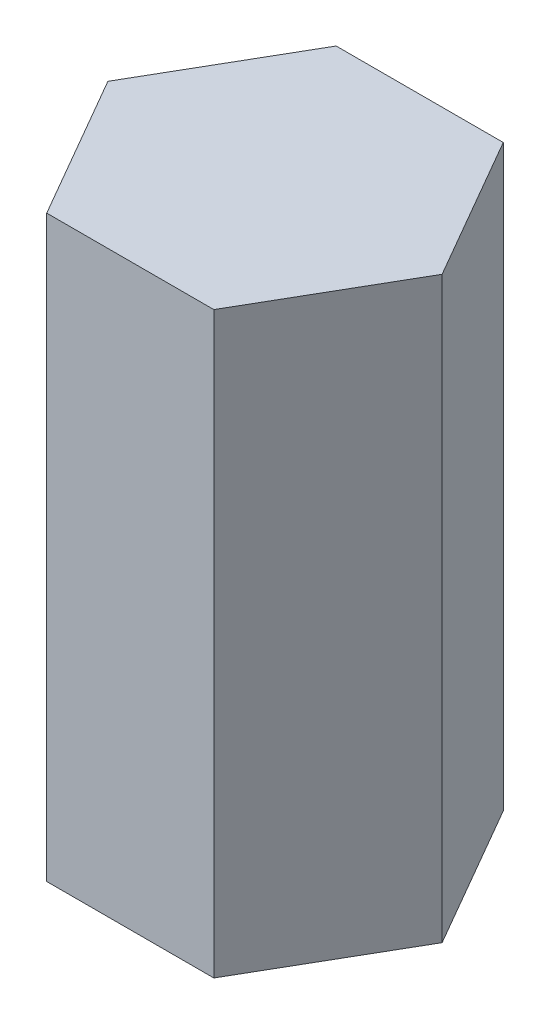
ISO-10303-21;
HEADER;
FILE_DESCRIPTION(('STEP AP214'),'2;1');
FILE_NAME('part.step','',(''),(''),'','','');
FILE_SCHEMA(('AUTOMOTIVE_DESIGN { 1 0 10303 214 1 1 1 1 }'));
ENDSEC;
DATA;
#1=APPLICATION_CONTEXT('core data for automotive mechanical design processes');
#2=APPLICATION_PROTOCOL_DEFINITION('international standard','automotive_design',2000,#1);
#3=PRODUCT_CONTEXT('',#1,'mechanical');
#4=PRODUCT('Part','Part','',(#3));
#5=PRODUCT_RELATED_PRODUCT_CATEGORY('part','',(#4));
#6=PRODUCT_DEFINITION_FORMATION('','',#4);
#7=PRODUCT_DEFINITION_CONTEXT('part definition',#1,'design');
#8=PRODUCT_DEFINITION('design','',#6,#7);
#9=PRODUCT_DEFINITION_SHAPE('','',#8);
#10=(LENGTH_UNIT() NAMED_UNIT(*) SI_UNIT(.MILLI.,.METRE.));
#11=(NAMED_UNIT(*) PLANE_ANGLE_UNIT() SI_UNIT($,.RADIAN.));
#12=(NAMED_UNIT(*) SI_UNIT($,.STERADIAN.) SOLID_ANGLE_UNIT());
#13=UNCERTAINTY_MEASURE_WITH_UNIT(LENGTH_MEASURE(1.E-05),#10,'distance_accuracy_value','');
#14=(GEOMETRIC_REPRESENTATION_CONTEXT(3) GLOBAL_UNCERTAINTY_ASSIGNED_CONTEXT((#13)) GLOBAL_UNIT_ASSIGNED_CONTEXT((#10,
#11,#12)) REPRESENTATION_CONTEXT('',''));
#15=CARTESIAN_POINT('',(0.,0.,0.));
#16=DIRECTION('',(0.,0.,1.));
#17=DIRECTION('',(1.,0.,0.));
#18=AXIS2_PLACEMENT_3D('',#15,#16,#17);
#19=CARTESIAN_POINT('',(4.33012701892219,30.,7.50000000000002));
#20=DIRECTION('',(-0.866025403784439,0.,-0.5));
#21=DIRECTION('',(-0.5,0.,0.866025403784439));
#22=AXIS2_PLACEMENT_3D('',#19,#20,#21);
#23=PLANE('',#22);
#24=DIRECTION('',(0.5,0.,-0.866025403784439));
#25=VECTOR('',#24,1.);
#26=CARTESIAN_POINT('',(4.33012701892219,0.,7.50000000000002));
#27=LINE('',#26,#25);
#28=CARTESIAN_POINT('',(4.33012701892219,0.,7.50000000000002));
#29=VERTEX_POINT('',#28);
#30=CARTESIAN_POINT('',(8.66025403784439,0.,0.));
#31=VERTEX_POINT('',#30);
#32=EDGE_CURVE('E121',#29,#31,#27,.T.);
#33=ORIENTED_EDGE('',*,*,#32,.T.);
#34=DIRECTION('',(0.,-1.,0.));
#35=VECTOR('',#34,1.);
#36=CARTESIAN_POINT('',(8.66025403784439,30.,0.));
#37=LINE('',#36,#35);
#38=CARTESIAN_POINT('',(8.66025403784439,30.,0.));
#39=VERTEX_POINT('',#38);
#40=EDGE_CURVE('E11',#39,#31,#37,.T.);
#41=ORIENTED_EDGE('',*,*,#40,.F.);
#42=DIRECTION('',(0.5,0.,-0.866025403784439));
#43=VECTOR('',#42,1.);
#44=CARTESIAN_POINT('',(4.33012701892219,30.,7.50000000000002));
#45=LINE('',#44,#43);
#46=CARTESIAN_POINT('',(4.33012701892219,30.,7.50000000000002));
#47=VERTEX_POINT('',#46);
#48=EDGE_CURVE('E131',#47,#39,#45,.T.);
#49=ORIENTED_EDGE('',*,*,#48,.F.);
#50=DIRECTION('',(0.,-1.,0.));
#51=VECTOR('',#50,1.);
#52=CARTESIAN_POINT('',(4.33012701892219,30.,7.50000000000002));
#53=LINE('',#52,#51);
#54=EDGE_CURVE('E117',#47,#29,#53,.T.);
#55=ORIENTED_EDGE('',*,*,#54,.T.);
#56=EDGE_LOOP('',(#33,#41,#49,#55));
#57=FACE_BOUND('',#56,.T.);
#58=ADVANCED_FACE('F37',(#57),#23,.F.);
#59=CARTESIAN_POINT('',(8.66025403784439,30.,0.));
#60=DIRECTION('',(-0.866025403784439,0.,0.499999999999999));
#61=DIRECTION('',(0.499999999999999,0.,0.866025403784439));
#62=AXIS2_PLACEMENT_3D('',#59,#60,#61);
#63=PLANE('',#62);
#64=DIRECTION('',(-0.499999999999999,0.,-0.866025403784439));
#65=VECTOR('',#64,1.);
#66=CARTESIAN_POINT('',(8.66025403784439,0.,0.));
#67=LINE('',#66,#65);
#68=CARTESIAN_POINT('',(4.33012701892219,0.,-7.50000000000003));
#69=VERTEX_POINT('',#68);
#70=EDGE_CURVE('E124',#31,#69,#67,.T.);
#71=ORIENTED_EDGE('',*,*,#70,.T.);
#72=DIRECTION('',(0.,-1.,0.));
#73=VECTOR('',#72,1.);
#74=CARTESIAN_POINT('',(4.33012701892219,30.,-7.50000000000003));
#75=LINE('',#74,#73);
#76=CARTESIAN_POINT('',(4.33012701892219,30.,-7.50000000000003));
#77=VERTEX_POINT('',#76);
#78=EDGE_CURVE('E45',#77,#69,#75,.T.);
#79=ORIENTED_EDGE('',*,*,#78,.F.);
#80=DIRECTION('',(-0.499999999999999,0.,-0.866025403784439));
#81=VECTOR('',#80,1.);
#82=CARTESIAN_POINT('',(8.66025403784439,30.,0.));
#83=LINE('',#82,#81);
#84=EDGE_CURVE('E90',#39,#77,#83,.T.);
#85=ORIENTED_EDGE('',*,*,#84,.F.);
#86=ORIENTED_EDGE('',*,*,#40,.T.);
#87=EDGE_LOOP('',(#71,#79,#85,#86));
#88=FACE_BOUND('',#87,.T.);
#89=ADVANCED_FACE('F155',(#88),#63,.F.);
#90=CARTESIAN_POINT('',(4.33012701892219,30.,-7.50000000000003));
#91=DIRECTION('',(0.,0.,1.));
#92=DIRECTION('',(1.,0.,0.));
#93=AXIS2_PLACEMENT_3D('',#90,#91,#92);
#94=PLANE('',#93);
#95=DIRECTION('',(-1.,0.,0.));
#96=VECTOR('',#95,1.);
#97=CARTESIAN_POINT('',(4.33012701892219,0.,-7.50000000000003));
#98=LINE('',#97,#96);
#99=CARTESIAN_POINT('',(-4.33012701892219,0.,-7.50000000000003));
#100=VERTEX_POINT('',#99);
#101=EDGE_CURVE('E126',#69,#100,#98,.T.);
#102=ORIENTED_EDGE('',*,*,#101,.T.);
#103=DIRECTION('',(0.,-1.,0.));
#104=VECTOR('',#103,1.);
#105=CARTESIAN_POINT('',(-4.33012701892219,30.,-7.50000000000003));
#106=LINE('',#105,#104);
#107=CARTESIAN_POINT('',(-4.33012701892219,30.,-7.50000000000003));
#108=VERTEX_POINT('',#107);
#109=EDGE_CURVE('E112',#108,#100,#106,.T.);
#110=ORIENTED_EDGE('',*,*,#109,.F.);
#111=DIRECTION('',(-1.,0.,0.));
#112=VECTOR('',#111,1.);
#113=CARTESIAN_POINT('',(4.33012701892219,30.,-7.50000000000003));
#114=LINE('',#113,#112);
#115=EDGE_CURVE('E103',#77,#108,#114,.T.);
#116=ORIENTED_EDGE('',*,*,#115,.F.);
#117=ORIENTED_EDGE('',*,*,#78,.T.);
#118=EDGE_LOOP('',(#102,#110,#116,#117));
#119=FACE_BOUND('',#118,.T.);
#120=ADVANCED_FACE('F137',(#119),#94,.F.);
#121=CARTESIAN_POINT('',(-4.33012701892219,30.,-7.50000000000003));
#122=DIRECTION('',(0.866025403784439,0.,0.5));
#123=DIRECTION('',(0.5,0.,-0.866025403784439));
#124=AXIS2_PLACEMENT_3D('',#121,#122,#123);
#125=PLANE('',#124);
#126=DIRECTION('',(-0.5,0.,0.866025403784439));
#127=VECTOR('',#126,1.);
#128=CARTESIAN_POINT('',(-4.33012701892219,0.,-7.50000000000003));
#129=LINE('',#128,#127);
#130=CARTESIAN_POINT('',(-8.66025403784441,0.,0.));
#131=VERTEX_POINT('',#130);
#132=EDGE_CURVE('E111',#100,#131,#129,.T.);
#133=ORIENTED_EDGE('',*,*,#132,.T.);
#134=DIRECTION('',(0.,-1.,0.));
#135=VECTOR('',#134,1.);
#136=CARTESIAN_POINT('',(-8.66025403784441,30.,0.));
#137=LINE('',#136,#135);
#138=CARTESIAN_POINT('',(-8.66025403784441,30.,0.));
#139=VERTEX_POINT('',#138);
#140=EDGE_CURVE('E108',#139,#131,#137,.T.);
#141=ORIENTED_EDGE('',*,*,#140,.F.);
#142=DIRECTION('',(-0.5,0.,0.866025403784439));
#143=VECTOR('',#142,1.);
#144=CARTESIAN_POINT('',(-4.33012701892219,30.,-7.50000000000003));
#145=LINE('',#144,#143);
#146=EDGE_CURVE('E97',#108,#139,#145,.T.);
#147=ORIENTED_EDGE('',*,*,#146,.F.);
#148=ORIENTED_EDGE('',*,*,#109,.T.);
#149=EDGE_LOOP('',(#133,#141,#147,#148));
#150=FACE_BOUND('',#149,.T.);
#151=ADVANCED_FACE('F109',(#150),#125,.F.);
#152=CARTESIAN_POINT('',(-8.66025403784441,30.,0.));
#153=DIRECTION('',(0.866025403784439,0.,-0.5));
#154=DIRECTION('',(-0.5,0.,-0.866025403784439));
#155=AXIS2_PLACEMENT_3D('',#152,#153,#154);
#156=PLANE('',#155);
#157=DIRECTION('',(0.5,0.,0.866025403784439));
#158=VECTOR('',#157,1.);
#159=CARTESIAN_POINT('',(-8.66025403784441,0.,0.));
#160=LINE('',#159,#158);
#161=CARTESIAN_POINT('',(-4.33012701892221,0.,7.50000000000002));
#162=VERTEX_POINT('',#161);
#163=EDGE_CURVE('E76',#131,#162,#160,.T.);
#164=ORIENTED_EDGE('',*,*,#163,.T.);
#165=DIRECTION('',(0.,-1.,0.));
#166=VECTOR('',#165,1.);
#167=CARTESIAN_POINT('',(-4.33012701892221,30.,7.50000000000002));
#168=LINE('',#167,#166);
#169=CARTESIAN_POINT('',(-4.33012701892221,30.,7.50000000000002));
#170=VERTEX_POINT('',#169);
#171=EDGE_CURVE('E113',#170,#162,#168,.T.);
#172=ORIENTED_EDGE('',*,*,#171,.F.);
#173=DIRECTION('',(0.5,0.,0.866025403784439));
#174=VECTOR('',#173,1.);
#175=CARTESIAN_POINT('',(-8.66025403784441,30.,0.));
#176=LINE('',#175,#174);
#177=EDGE_CURVE('E101',#139,#170,#176,.T.);
#178=ORIENTED_EDGE('',*,*,#177,.F.);
#179=ORIENTED_EDGE('',*,*,#140,.T.);
#180=EDGE_LOOP('',(#164,#172,#178,#179));
#181=FACE_BOUND('',#180,.T.);
#182=ADVANCED_FACE('F115',(#181),#156,.F.);
#183=CARTESIAN_POINT('',(-4.33012701892221,30.,7.50000000000002));
#184=DIRECTION('',(0.,0.,-1.));
#185=DIRECTION('',(-1.,0.,0.));
#186=AXIS2_PLACEMENT_3D('',#183,#184,#185);
#187=PLANE('',#186);
#188=DIRECTION('',(1.,0.,0.));
#189=VECTOR('',#188,1.);
#190=CARTESIAN_POINT('',(-4.33012701892221,0.,7.50000000000002));
#191=LINE('',#190,#189);
#192=EDGE_CURVE('E82',#162,#29,#191,.T.);
#193=ORIENTED_EDGE('',*,*,#192,.T.);
#194=ORIENTED_EDGE('',*,*,#54,.F.);
#195=DIRECTION('',(1.,0.,0.));
#196=VECTOR('',#195,1.);
#197=CARTESIAN_POINT('',(-4.33012701892221,30.,7.50000000000002));
#198=LINE('',#197,#196);
#199=EDGE_CURVE('E53',#170,#47,#198,.T.);
#200=ORIENTED_EDGE('',*,*,#199,.F.);
#201=ORIENTED_EDGE('',*,*,#171,.T.);
#202=EDGE_LOOP('',(#193,#194,#200,#201));
#203=FACE_BOUND('',#202,.T.);
#204=ADVANCED_FACE('F144',(#203),#187,.F.);
#205=CARTESIAN_POINT('',(0.,30.,0.));
#206=DIRECTION('',(0.,1.,0.));
#207=DIRECTION('',(0.,0.,1.));
#208=AXIS2_PLACEMENT_3D('',#205,#206,#207);
#209=PLANE('',#208);
#210=ORIENTED_EDGE('',*,*,#48,.T.);
#211=ORIENTED_EDGE('',*,*,#84,.T.);
#212=ORIENTED_EDGE('',*,*,#115,.T.);
#213=ORIENTED_EDGE('',*,*,#146,.T.);
#214=ORIENTED_EDGE('',*,*,#177,.T.);
#215=ORIENTED_EDGE('',*,*,#199,.T.);
#216=EDGE_LOOP('',(#210,#211,#212,#213,#214,#215));
#217=FACE_BOUND('',#216,.T.);
#218=ADVANCED_FACE('F99',(#217),#209,.T.);
#219=CARTESIAN_POINT('',(0.,0.,0.));
#220=DIRECTION('',(0.,1.,0.));
#221=DIRECTION('',(0.,0.,1.));
#222=AXIS2_PLACEMENT_3D('',#219,#220,#221);
#223=PLANE('',#222);
#224=ORIENTED_EDGE('',*,*,#32,.F.);
#225=ORIENTED_EDGE('',*,*,#192,.F.);
#226=ORIENTED_EDGE('',*,*,#163,.F.);
#227=ORIENTED_EDGE('',*,*,#132,.F.);
#228=ORIENTED_EDGE('',*,*,#101,.F.);
#229=ORIENTED_EDGE('',*,*,#70,.F.);
#230=EDGE_LOOP('',(#224,#225,#226,#227,#228,#229));
#231=FACE_BOUND('',#230,.T.);
#232=ADVANCED_FACE('F140',(#231),#223,.F.);
#233=CLOSED_SHELL('',(#58,#89,#120,#151,#182,#204,#218,#232));
#234=MANIFOLD_SOLID_BREP('B2',#233);
#235=ADVANCED_BREP_SHAPE_REPRESENTATION('',(#18,#234),#14);
#236=SHAPE_DEFINITION_REPRESENTATION(#9,#235);
ENDSEC;
END-ISO-10303-21;
